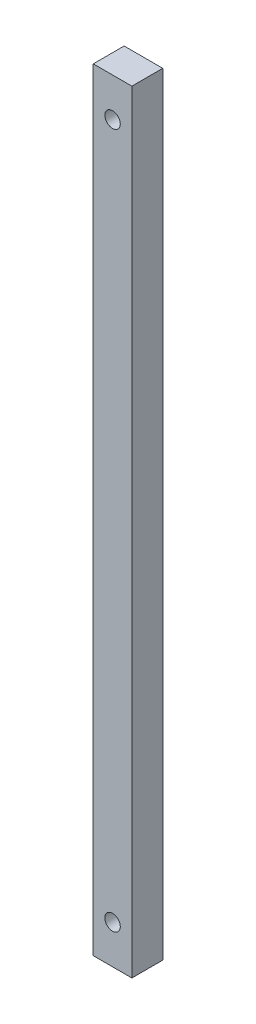
ISO-10303-21;
HEADER;
FILE_DESCRIPTION(('STEP AP214'),'2;1');
FILE_NAME('part.step','',(''),(''),'','','');
FILE_SCHEMA(('AUTOMOTIVE_DESIGN { 1 0 10303 214 1 1 1 1 }'));
ENDSEC;
DATA;
#1=APPLICATION_CONTEXT('core data for automotive mechanical design processes');
#2=APPLICATION_PROTOCOL_DEFINITION('international standard','automotive_design',2000,#1);
#3=PRODUCT_CONTEXT('',#1,'mechanical');
#4=PRODUCT('Part','Part','',(#3));
#5=PRODUCT_RELATED_PRODUCT_CATEGORY('part','',(#4));
#6=PRODUCT_DEFINITION_FORMATION('','',#4);
#7=PRODUCT_DEFINITION_CONTEXT('part definition',#1,'design');
#8=PRODUCT_DEFINITION('design','',#6,#7);
#9=PRODUCT_DEFINITION_SHAPE('','',#8);
#10=(LENGTH_UNIT() NAMED_UNIT(*) SI_UNIT(.MILLI.,.METRE.));
#11=(NAMED_UNIT(*) PLANE_ANGLE_UNIT() SI_UNIT($,.RADIAN.));
#12=(NAMED_UNIT(*) SI_UNIT($,.STERADIAN.) SOLID_ANGLE_UNIT());
#13=UNCERTAINTY_MEASURE_WITH_UNIT(LENGTH_MEASURE(1.E-05),#10,'distance_accuracy_value','');
#14=(GEOMETRIC_REPRESENTATION_CONTEXT(3) GLOBAL_UNCERTAINTY_ASSIGNED_CONTEXT((#13)) GLOBAL_UNIT_ASSIGNED_CONTEXT((#10,
#11,#12)) REPRESENTATION_CONTEXT('',''));
#15=CARTESIAN_POINT('',(0.,0.,0.));
#16=DIRECTION('',(0.,0.,1.));
#17=DIRECTION('',(1.,0.,0.));
#18=AXIS2_PLACEMENT_3D('',#15,#16,#17);
#19=CARTESIAN_POINT('',(-2.5,100.,-2.));
#20=DIRECTION('',(1.,0.,0.));
#21=DIRECTION('',(0.,0.,-1.));
#22=AXIS2_PLACEMENT_3D('',#19,#20,#21);
#23=PLANE('',#22);
#24=DIRECTION('',(0.,0.,1.));
#25=VECTOR('',#24,1.);
#26=CARTESIAN_POINT('',(-2.5,0.,-2.));
#27=LINE('',#26,#25);
#28=CARTESIAN_POINT('',(-2.5,0.,-2.));
#29=VERTEX_POINT('',#28);
#30=CARTESIAN_POINT('',(-2.5,0.,2.));
#31=VERTEX_POINT('',#30);
#32=EDGE_CURVE('E106',#29,#31,#27,.T.);
#33=ORIENTED_EDGE('',*,*,#32,.T.);
#34=DIRECTION('',(0.,-1.,0.));
#35=VECTOR('',#34,1.);
#36=CARTESIAN_POINT('',(-2.5,100.,2.));
#37=LINE('',#36,#35);
#38=CARTESIAN_POINT('',(-2.5,100.,2.));
#39=VERTEX_POINT('',#38);
#40=EDGE_CURVE('E11',#39,#31,#37,.T.);
#41=ORIENTED_EDGE('',*,*,#40,.F.);
#42=DIRECTION('',(0.,0.,1.));
#43=VECTOR('',#42,1.);
#44=CARTESIAN_POINT('',(-2.5,100.,-2.));
#45=LINE('',#44,#43);
#46=CARTESIAN_POINT('',(-2.5,100.,-2.));
#47=VERTEX_POINT('',#46);
#48=EDGE_CURVE('E88',#47,#39,#45,.T.);
#49=ORIENTED_EDGE('',*,*,#48,.F.);
#50=DIRECTION('',(0.,-1.,0.));
#51=VECTOR('',#50,1.);
#52=CARTESIAN_POINT('',(-2.5,100.,-2.));
#53=LINE('',#52,#51);
#54=EDGE_CURVE('E55',#47,#29,#53,.T.);
#55=ORIENTED_EDGE('',*,*,#54,.T.);
#56=EDGE_LOOP('',(#33,#41,#49,#55));
#57=FACE_BOUND('',#56,.T.);
#58=ADVANCED_FACE('F38',(#57),#23,.F.);
#59=CARTESIAN_POINT('',(-2.5,100.,2.));
#60=DIRECTION('',(0.,0.,-1.));
#61=DIRECTION('',(-1.,0.,0.));
#62=AXIS2_PLACEMENT_3D('',#59,#60,#61);
#63=PLANE('',#62);
#64=CARTESIAN_POINT('',(0.,5.,2.));
#65=DIRECTION('',(0.,0.,-1.));
#66=DIRECTION('',(-1.,0.,0.));
#67=AXIS2_PLACEMENT_3D('',#64,#65,#66);
#68=CIRCLE('',#67,1.);
#69=CARTESIAN_POINT('',(-1.,5.,2.));
#70=VERTEX_POINT('',#69);
#71=EDGE_CURVE('E109',#70,#70,#68,.T.);
#72=ORIENTED_EDGE('',*,*,#71,.T.);
#73=EDGE_LOOP('',(#72));
#74=FACE_BOUND('',#73,.T.);
#75=CARTESIAN_POINT('',(0.,95.,2.));
#76=DIRECTION('',(0.,0.,-1.));
#77=DIRECTION('',(-1.,0.,0.));
#78=AXIS2_PLACEMENT_3D('',#75,#76,#77);
#79=CIRCLE('',#78,1.);
#80=CARTESIAN_POINT('',(-1.,95.,2.));
#81=VERTEX_POINT('',#80);
#82=EDGE_CURVE('E128',#81,#81,#79,.T.);
#83=ORIENTED_EDGE('',*,*,#82,.T.);
#84=EDGE_LOOP('',(#83));
#85=FACE_BOUND('',#84,.T.);
#86=DIRECTION('',(1.,0.,0.));
#87=VECTOR('',#86,1.);
#88=CARTESIAN_POINT('',(-2.5,0.,2.));
#89=LINE('',#88,#87);
#90=CARTESIAN_POINT('',(2.5,0.,2.));
#91=VERTEX_POINT('',#90);
#92=EDGE_CURVE('E94',#31,#91,#89,.T.);
#93=ORIENTED_EDGE('',*,*,#92,.T.);
#94=DIRECTION('',(0.,-1.,0.));
#95=VECTOR('',#94,1.);
#96=CARTESIAN_POINT('',(2.5,100.,2.));
#97=LINE('',#96,#95);
#98=CARTESIAN_POINT('',(2.5,100.,2.));
#99=VERTEX_POINT('',#98);
#100=EDGE_CURVE('E47',#99,#91,#97,.T.);
#101=ORIENTED_EDGE('',*,*,#100,.F.);
#102=DIRECTION('',(1.,0.,0.));
#103=VECTOR('',#102,1.);
#104=CARTESIAN_POINT('',(-2.5,100.,2.));
#105=LINE('',#104,#103);
#106=EDGE_CURVE('E80',#39,#99,#105,.T.);
#107=ORIENTED_EDGE('',*,*,#106,.F.);
#108=ORIENTED_EDGE('',*,*,#40,.T.);
#109=EDGE_LOOP('',(#93,#101,#107,#108));
#110=FACE_BOUND('',#109,.T.);
#111=ADVANCED_FACE('F93',(#74,#85,#110),#63,.F.);
#112=CARTESIAN_POINT('',(2.5,100.,-2.));
#113=DIRECTION('',(1.,0.,0.));
#114=DIRECTION('',(0.,0.,-1.));
#115=AXIS2_PLACEMENT_3D('',#112,#113,#114);
#116=PLANE('',#115);
#117=DIRECTION('',(0.,0.,1.));
#118=VECTOR('',#117,1.);
#119=CARTESIAN_POINT('',(2.5,0.,-2.));
#120=LINE('',#119,#118);
#121=CARTESIAN_POINT('',(2.5,0.,-2.));
#122=VERTEX_POINT('',#121);
#123=EDGE_CURVE('E112',#122,#91,#120,.T.);
#124=ORIENTED_EDGE('',*,*,#123,.F.);
#125=DIRECTION('',(0.,-1.,0.));
#126=VECTOR('',#125,1.);
#127=CARTESIAN_POINT('',(2.5,100.,-2.));
#128=LINE('',#127,#126);
#129=CARTESIAN_POINT('',(2.5,100.,-2.));
#130=VERTEX_POINT('',#129);
#131=EDGE_CURVE('E69',#130,#122,#128,.T.);
#132=ORIENTED_EDGE('',*,*,#131,.F.);
#133=DIRECTION('',(0.,0.,1.));
#134=VECTOR('',#133,1.);
#135=CARTESIAN_POINT('',(2.5,100.,-2.));
#136=LINE('',#135,#134);
#137=EDGE_CURVE('E87',#130,#99,#136,.T.);
#138=ORIENTED_EDGE('',*,*,#137,.T.);
#139=ORIENTED_EDGE('',*,*,#100,.T.);
#140=EDGE_LOOP('',(#124,#132,#138,#139));
#141=FACE_BOUND('',#140,.T.);
#142=ADVANCED_FACE('F98',(#141),#116,.T.);
#143=CARTESIAN_POINT('',(-2.5,100.,-2.));
#144=DIRECTION('',(0.,0.,-1.));
#145=DIRECTION('',(-1.,0.,0.));
#146=AXIS2_PLACEMENT_3D('',#143,#144,#145);
#147=PLANE('',#146);
#148=CARTESIAN_POINT('',(0.,5.,-2.));
#149=DIRECTION('',(0.,0.,-1.));
#150=DIRECTION('',(-1.,0.,0.));
#151=AXIS2_PLACEMENT_3D('',#148,#149,#150);
#152=CIRCLE('',#151,1.);
#153=CARTESIAN_POINT('',(-1.,5.,-2.));
#154=VERTEX_POINT('',#153);
#155=EDGE_CURVE('E132',#154,#154,#152,.T.);
#156=ORIENTED_EDGE('',*,*,#155,.F.);
#157=EDGE_LOOP('',(#156));
#158=FACE_BOUND('',#157,.T.);
#159=CARTESIAN_POINT('',(0.,95.,-2.));
#160=DIRECTION('',(0.,0.,-1.));
#161=DIRECTION('',(-1.,0.,0.));
#162=AXIS2_PLACEMENT_3D('',#159,#160,#161);
#163=CIRCLE('',#162,1.);
#164=CARTESIAN_POINT('',(-1.,95.,-2.));
#165=VERTEX_POINT('',#164);
#166=EDGE_CURVE('E133',#165,#165,#163,.T.);
#167=ORIENTED_EDGE('',*,*,#166,.F.);
#168=EDGE_LOOP('',(#167));
#169=FACE_BOUND('',#168,.T.);
#170=DIRECTION('',(1.,0.,0.));
#171=VECTOR('',#170,1.);
#172=CARTESIAN_POINT('',(-2.5,0.,-2.));
#173=LINE('',#172,#171);
#174=EDGE_CURVE('E115',#29,#122,#173,.T.);
#175=ORIENTED_EDGE('',*,*,#174,.F.);
#176=ORIENTED_EDGE('',*,*,#54,.F.);
#177=DIRECTION('',(1.,0.,0.));
#178=VECTOR('',#177,1.);
#179=CARTESIAN_POINT('',(-2.5,100.,-2.));
#180=LINE('',#179,#178);
#181=EDGE_CURVE('E100',#47,#130,#180,.T.);
#182=ORIENTED_EDGE('',*,*,#181,.T.);
#183=ORIENTED_EDGE('',*,*,#131,.T.);
#184=EDGE_LOOP('',(#175,#176,#182,#183));
#185=FACE_BOUND('',#184,.T.);
#186=ADVANCED_FACE('F144',(#158,#169,#185),#147,.T.);
#187=CARTESIAN_POINT('',(0.,100.,0.));
#188=DIRECTION('',(0.,1.,0.));
#189=DIRECTION('',(0.,0.,1.));
#190=AXIS2_PLACEMENT_3D('',#187,#188,#189);
#191=PLANE('',#190);
#192=ORIENTED_EDGE('',*,*,#48,.T.);
#193=ORIENTED_EDGE('',*,*,#106,.T.);
#194=ORIENTED_EDGE('',*,*,#137,.F.);
#195=ORIENTED_EDGE('',*,*,#181,.F.);
#196=EDGE_LOOP('',(#192,#193,#194,#195));
#197=FACE_BOUND('',#196,.T.);
#198=ADVANCED_FACE('F84',(#197),#191,.T.);
#199=CARTESIAN_POINT('',(0.,0.,0.));
#200=DIRECTION('',(0.,1.,0.));
#201=DIRECTION('',(0.,0.,1.));
#202=AXIS2_PLACEMENT_3D('',#199,#200,#201);
#203=PLANE('',#202);
#204=ORIENTED_EDGE('',*,*,#32,.F.);
#205=ORIENTED_EDGE('',*,*,#174,.T.);
#206=ORIENTED_EDGE('',*,*,#123,.T.);
#207=ORIENTED_EDGE('',*,*,#92,.F.);
#208=EDGE_LOOP('',(#204,#205,#206,#207));
#209=FACE_BOUND('',#208,.T.);
#210=ADVANCED_FACE('F153',(#209),#203,.F.);
#211=CARTESIAN_POINT('',(0.,95.,8.));
#212=DIRECTION('',(0.,0.,-1.));
#213=DIRECTION('',(-1.,0.,0.));
#214=AXIS2_PLACEMENT_3D('',#211,#212,#213);
#215=CYLINDRICAL_SURFACE('',#214,1.);
#216=ORIENTED_EDGE('',*,*,#166,.T.);
#217=EDGE_LOOP('',(#216));
#218=FACE_BOUND('',#217,.T.);
#219=ORIENTED_EDGE('',*,*,#82,.F.);
#220=EDGE_LOOP('',(#219));
#221=FACE_BOUND('',#220,.T.);
#222=ADVANCED_FACE('F150',(#218,#221),#215,.F.);
#223=CARTESIAN_POINT('',(0.,5.,8.));
#224=DIRECTION('',(0.,0.,-1.));
#225=DIRECTION('',(-1.,0.,0.));
#226=AXIS2_PLACEMENT_3D('',#223,#224,#225);
#227=CYLINDRICAL_SURFACE('',#226,1.);
#228=ORIENTED_EDGE('',*,*,#155,.T.);
#229=EDGE_LOOP('',(#228));
#230=FACE_BOUND('',#229,.T.);
#231=ORIENTED_EDGE('',*,*,#71,.F.);
#232=EDGE_LOOP('',(#231));
#233=FACE_BOUND('',#232,.T.);
#234=ADVANCED_FACE('F141',(#230,#233),#227,.F.);
#235=CLOSED_SHELL('',(#58,#111,#142,#186,#198,#210,#222,#234));
#236=MANIFOLD_SOLID_BREP('B2',#235);
#237=ADVANCED_BREP_SHAPE_REPRESENTATION('',(#18,#236),#14);
#238=SHAPE_DEFINITION_REPRESENTATION(#9,#237);
ENDSEC;
END-ISO-10303-21;
